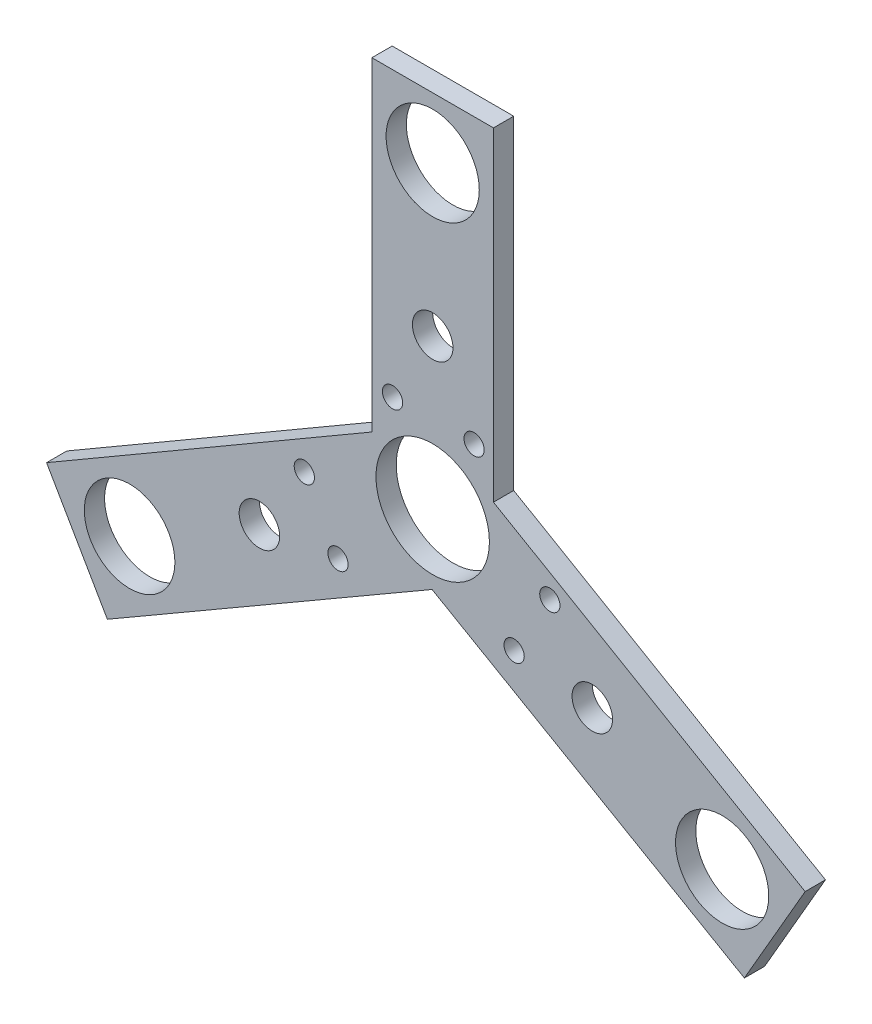
ISO-10303-21;
HEADER;
FILE_DESCRIPTION(('STEP AP214'),'2;1');
FILE_NAME('part.step','',(''),(''),'','','');
FILE_SCHEMA(('AUTOMOTIVE_DESIGN { 1 0 10303 214 1 1 1 1 }'));
ENDSEC;
DATA;
#1=APPLICATION_CONTEXT('core data for automotive mechanical design processes');
#2=APPLICATION_PROTOCOL_DEFINITION('international standard','automotive_design',2000,#1);
#3=PRODUCT_CONTEXT('',#1,'mechanical');
#4=PRODUCT('Part','Part','',(#3));
#5=PRODUCT_RELATED_PRODUCT_CATEGORY('part','',(#4));
#6=PRODUCT_DEFINITION_FORMATION('','',#4);
#7=PRODUCT_DEFINITION_CONTEXT('part definition',#1,'design');
#8=PRODUCT_DEFINITION('design','',#6,#7);
#9=PRODUCT_DEFINITION_SHAPE('','',#8);
#10=(LENGTH_UNIT() NAMED_UNIT(*) SI_UNIT(.MILLI.,.METRE.));
#11=(NAMED_UNIT(*) PLANE_ANGLE_UNIT() SI_UNIT($,.RADIAN.));
#12=(NAMED_UNIT(*) SI_UNIT($,.STERADIAN.) SOLID_ANGLE_UNIT());
#13=UNCERTAINTY_MEASURE_WITH_UNIT(LENGTH_MEASURE(1.E-05),#10,'distance_accuracy_value','');
#14=(GEOMETRIC_REPRESENTATION_CONTEXT(3) GLOBAL_UNCERTAINTY_ASSIGNED_CONTEXT((#13)) GLOBAL_UNIT_ASSIGNED_CONTEXT((#10,
#11,#12)) REPRESENTATION_CONTEXT('',''));
#15=CARTESIAN_POINT('',(0.,0.,0.));
#16=DIRECTION('',(0.,0.,1.));
#17=DIRECTION('',(1.,0.,0.));
#18=AXIS2_PLACEMENT_3D('',#15,#16,#17);
#19=CARTESIAN_POINT('',(-30.,178.,-10.));
#20=DIRECTION('',(-1.,0.,0.));
#21=DIRECTION('',(0.,-1.,0.));
#22=AXIS2_PLACEMENT_3D('',#19,#20,#21);
#23=PLANE('',#22);
#24=DIRECTION('',(0.,-1.,0.));
#25=VECTOR('',#24,1.);
#26=CARTESIAN_POINT('',(-30.,178.,0.));
#27=LINE('',#26,#25);
#28=CARTESIAN_POINT('',(-30.,178.,0.));
#29=VERTEX_POINT('',#28);
#30=CARTESIAN_POINT('',(-30.,18.,0.));
#31=VERTEX_POINT('',#30);
#32=EDGE_CURVE('E137',#29,#31,#27,.T.);
#33=ORIENTED_EDGE('',*,*,#32,.F.);
#34=DIRECTION('',(0.,0.,1.));
#35=VECTOR('',#34,1.);
#36=CARTESIAN_POINT('',(-30.,178.,-10.));
#37=LINE('',#36,#35);
#38=CARTESIAN_POINT('',(-30.,178.,-10.));
#39=VERTEX_POINT('',#38);
#40=EDGE_CURVE('E11',#39,#29,#37,.T.);
#41=ORIENTED_EDGE('',*,*,#40,.F.);
#42=DIRECTION('',(0.,-1.,0.));
#43=VECTOR('',#42,1.);
#44=CARTESIAN_POINT('',(-30.,178.,-10.));
#45=LINE('',#44,#43);
#46=CARTESIAN_POINT('',(-30.,18.,-10.));
#47=VERTEX_POINT('',#46);
#48=EDGE_CURVE('E161',#39,#47,#45,.T.);
#49=ORIENTED_EDGE('',*,*,#48,.T.);
#50=DIRECTION('',(0.,0.,1.));
#51=VECTOR('',#50,1.);
#52=CARTESIAN_POINT('',(-30.,18.,-10.));
#53=LINE('',#52,#51);
#54=EDGE_CURVE('E37',#47,#31,#53,.T.);
#55=ORIENTED_EDGE('',*,*,#54,.T.);
#56=EDGE_LOOP('',(#33,#41,#49,#55));
#57=FACE_BOUND('',#56,.T.);
#58=ADVANCED_FACE('F34',(#57),#23,.T.);
#59=CARTESIAN_POINT('',(-30.,178.,-10.));
#60=DIRECTION('',(0.,1.,0.));
#61=DIRECTION('',(0.,0.,1.));
#62=AXIS2_PLACEMENT_3D('',#59,#60,#61);
#63=PLANE('',#62);
#64=DIRECTION('',(-1.,0.,0.));
#65=VECTOR('',#64,1.);
#66=CARTESIAN_POINT('',(-30.,178.,0.));
#67=LINE('',#66,#65);
#68=CARTESIAN_POINT('',(30.,178.,0.));
#69=VERTEX_POINT('',#68);
#70=EDGE_CURVE('E159',#69,#29,#67,.T.);
#71=ORIENTED_EDGE('',*,*,#70,.F.);
#72=DIRECTION('',(0.,0.,1.));
#73=VECTOR('',#72,1.);
#74=CARTESIAN_POINT('',(30.,178.,-10.));
#75=LINE('',#74,#73);
#76=CARTESIAN_POINT('',(30.,178.,-10.));
#77=VERTEX_POINT('',#76);
#78=EDGE_CURVE('E43',#77,#69,#75,.T.);
#79=ORIENTED_EDGE('',*,*,#78,.F.);
#80=DIRECTION('',(-1.,0.,0.));
#81=VECTOR('',#80,1.);
#82=CARTESIAN_POINT('',(-30.,178.,-10.));
#83=LINE('',#82,#81);
#84=EDGE_CURVE('E127',#77,#39,#83,.T.);
#85=ORIENTED_EDGE('',*,*,#84,.T.);
#86=ORIENTED_EDGE('',*,*,#40,.T.);
#87=EDGE_LOOP('',(#71,#79,#85,#86));
#88=FACE_BOUND('',#87,.T.);
#89=ADVANCED_FACE('F175',(#88),#63,.T.);
#90=CARTESIAN_POINT('',(30.,178.,-10.));
#91=DIRECTION('',(1.,0.,0.));
#92=DIRECTION('',(0.,1.,0.));
#93=AXIS2_PLACEMENT_3D('',#90,#91,#92);
#94=PLANE('',#93);
#95=DIRECTION('',(0.,1.,0.));
#96=VECTOR('',#95,1.);
#97=CARTESIAN_POINT('',(30.,178.,0.));
#98=LINE('',#97,#96);
#99=CARTESIAN_POINT('',(30.,18.,0.));
#100=VERTEX_POINT('',#99);
#101=EDGE_CURVE('E114',#100,#69,#98,.T.);
#102=ORIENTED_EDGE('',*,*,#101,.F.);
#103=DIRECTION('',(0.,0.,1.));
#104=VECTOR('',#103,1.);
#105=CARTESIAN_POINT('',(30.,18.,-10.));
#106=LINE('',#105,#104);
#107=CARTESIAN_POINT('',(30.,18.,-10.));
#108=VERTEX_POINT('',#107);
#109=EDGE_CURVE('E109',#108,#100,#106,.T.);
#110=ORIENTED_EDGE('',*,*,#109,.F.);
#111=DIRECTION('',(0.,1.,0.));
#112=VECTOR('',#111,1.);
#113=CARTESIAN_POINT('',(30.,178.,-10.));
#114=LINE('',#113,#112);
#115=EDGE_CURVE('E112',#108,#77,#114,.T.);
#116=ORIENTED_EDGE('',*,*,#115,.T.);
#117=ORIENTED_EDGE('',*,*,#78,.T.);
#118=EDGE_LOOP('',(#102,#110,#116,#117));
#119=FACE_BOUND('',#118,.T.);
#120=ADVANCED_FACE('F111',(#119),#94,.T.);
#121=CARTESIAN_POINT('',(183.857450852518,-71.5091325908429,-10.));
#122=DIRECTION('',(0.502860295454174,0.864367701418639,0.));
#123=DIRECTION('',(-0.864367701418639,0.502860295454174,0.));
#124=AXIS2_PLACEMENT_3D('',#121,#122,#123);
#125=PLANE('',#124);
#126=DIRECTION('',(-0.864367701418639,0.502860295454174,0.));
#127=VECTOR('',#126,1.);
#128=CARTESIAN_POINT('',(183.857450852518,-71.5091325908429,0.));
#129=LINE('',#128,#127);
#130=CARTESIAN_POINT('',(183.857450852518,-71.5091325908429,0.));
#131=VERTEX_POINT('',#130);
#132=EDGE_CURVE('E156',#131,#100,#129,.T.);
#133=ORIENTED_EDGE('',*,*,#132,.F.);
#134=DIRECTION('',(0.,0.,1.));
#135=VECTOR('',#134,1.);
#136=CARTESIAN_POINT('',(183.857450852518,-71.5091325908429,-10.));
#137=LINE('',#136,#135);
#138=CARTESIAN_POINT('',(183.857450852518,-71.5091325908429,-10.));
#139=VERTEX_POINT('',#138);
#140=EDGE_CURVE('E119',#139,#131,#137,.T.);
#141=ORIENTED_EDGE('',*,*,#140,.F.);
#142=DIRECTION('',(-0.864367701418639,0.502860295454174,0.));
#143=VECTOR('',#142,1.);
#144=CARTESIAN_POINT('',(183.857450852518,-71.5091325908429,-10.));
#145=LINE('',#144,#143);
#146=EDGE_CURVE('E125',#139,#108,#145,.T.);
#147=ORIENTED_EDGE('',*,*,#146,.T.);
#148=ORIENTED_EDGE('',*,*,#109,.T.);
#149=EDGE_LOOP('',(#133,#141,#147,#148));
#150=FACE_BOUND('',#149,.T.);
#151=ADVANCED_FACE('F129',(#150),#125,.T.);
#152=CARTESIAN_POINT('',(183.857450852518,-71.5091325908429,-10.));
#153=DIRECTION('',(0.866025403784437,-0.500000000000004,0.));
#154=DIRECTION('',(0.500000000000004,0.866025403784437,0.));
#155=AXIS2_PLACEMENT_3D('',#152,#153,#154);
#156=PLANE('',#155);
#157=DIRECTION('',(0.500000000000004,0.866025403784437,0.));
#158=VECTOR('',#157,1.);
#159=CARTESIAN_POINT('',(183.857450852518,-71.5091325908429,0.));
#160=LINE('',#159,#158);
#161=CARTESIAN_POINT('',(153.857450852518,-123.470656817909,0.));
#162=VERTEX_POINT('',#161);
#163=EDGE_CURVE('E153',#162,#131,#160,.T.);
#164=ORIENTED_EDGE('',*,*,#163,.F.);
#165=DIRECTION('',(0.,0.,1.));
#166=VECTOR('',#165,1.);
#167=CARTESIAN_POINT('',(153.857450852518,-123.470656817909,-10.));
#168=LINE('',#167,#166);
#169=CARTESIAN_POINT('',(153.857450852518,-123.470656817909,-10.));
#170=VERTEX_POINT('',#169);
#171=EDGE_CURVE('E165',#170,#162,#168,.T.);
#172=ORIENTED_EDGE('',*,*,#171,.F.);
#173=DIRECTION('',(0.500000000000004,0.866025403784437,0.));
#174=VECTOR('',#173,1.);
#175=CARTESIAN_POINT('',(183.857450852518,-71.5091325908429,-10.));
#176=LINE('',#175,#174);
#177=EDGE_CURVE('E130',#170,#139,#176,.T.);
#178=ORIENTED_EDGE('',*,*,#177,.T.);
#179=ORIENTED_EDGE('',*,*,#140,.T.);
#180=EDGE_LOOP('',(#164,#172,#178,#179));
#181=FACE_BOUND('',#180,.T.);
#182=ADVANCED_FACE('F188',(#181),#156,.T.);
#183=CARTESIAN_POINT('',(153.857450852518,-123.470656817909,-10.));
#184=DIRECTION('',(-0.500000000000003,-0.866025403784437,0.));
#185=DIRECTION('',(0.866025403784437,-0.500000000000003,0.));
#186=AXIS2_PLACEMENT_3D('',#183,#184,#185);
#187=PLANE('',#186);
#188=DIRECTION('',(0.866025403784437,-0.500000000000003,0.));
#189=VECTOR('',#188,1.);
#190=CARTESIAN_POINT('',(153.857450852518,-123.470656817909,0.));
#191=LINE('',#190,#189);
#192=CARTESIAN_POINT('',(-0.295071021112231,-34.4706568179085,0.));
#193=VERTEX_POINT('',#192);
#194=EDGE_CURVE('E150',#193,#162,#191,.T.);
#195=ORIENTED_EDGE('',*,*,#194,.F.);
#196=DIRECTION('',(0.,0.,1.));
#197=VECTOR('',#196,1.);
#198=CARTESIAN_POINT('',(-0.295071021112231,-34.4706568179085,-10.));
#199=LINE('',#198,#197);
#200=CARTESIAN_POINT('',(-0.295071021112231,-34.4706568179085,-10.));
#201=VERTEX_POINT('',#200);
#202=EDGE_CURVE('E167',#201,#193,#199,.T.);
#203=ORIENTED_EDGE('',*,*,#202,.F.);
#204=DIRECTION('',(0.866025403784437,-0.500000000000003,0.));
#205=VECTOR('',#204,1.);
#206=CARTESIAN_POINT('',(153.857450852518,-123.470656817909,-10.));
#207=LINE('',#206,#205);
#208=EDGE_CURVE('E132',#201,#170,#207,.T.);
#209=ORIENTED_EDGE('',*,*,#208,.T.);
#210=ORIENTED_EDGE('',*,*,#171,.T.);
#211=EDGE_LOOP('',(#195,#203,#209,#210));
#212=FACE_BOUND('',#211,.T.);
#213=ADVANCED_FACE('F191',(#212),#187,.T.);
#214=CARTESIAN_POINT('',(-160.583702802877,-127.354060192087,-10.));
#215=DIRECTION('',(0.501378749161739,-0.865227917885808,0.));
#216=DIRECTION('',(0.865227917885808,0.501378749161739,0.));
#217=AXIS2_PLACEMENT_3D('',#214,#215,#216);
#218=PLANE('',#217);
#219=DIRECTION('',(0.865227917885808,0.501378749161739,0.));
#220=VECTOR('',#219,1.);
#221=CARTESIAN_POINT('',(-160.583702802877,-127.354060192087,0.));
#222=LINE('',#221,#220);
#223=CARTESIAN_POINT('',(-160.583702802877,-127.354060192087,0.));
#224=VERTEX_POINT('',#223);
#225=EDGE_CURVE('E147',#224,#193,#222,.T.);
#226=ORIENTED_EDGE('',*,*,#225,.F.);
#227=DIRECTION('',(0.,0.,1.));
#228=VECTOR('',#227,1.);
#229=CARTESIAN_POINT('',(-160.583702802877,-127.354060192087,-10.));
#230=LINE('',#229,#228);
#231=CARTESIAN_POINT('',(-160.583702802877,-127.354060192087,-10.));
#232=VERTEX_POINT('',#231);
#233=EDGE_CURVE('E169',#232,#224,#230,.T.);
#234=ORIENTED_EDGE('',*,*,#233,.F.);
#235=DIRECTION('',(0.865227917885808,0.501378749161739,0.));
#236=VECTOR('',#235,1.);
#237=CARTESIAN_POINT('',(-160.583702802877,-127.354060192087,-10.));
#238=LINE('',#237,#236);
#239=EDGE_CURVE('E354',#232,#201,#238,.T.);
#240=ORIENTED_EDGE('',*,*,#239,.T.);
#241=ORIENTED_EDGE('',*,*,#202,.T.);
#242=EDGE_LOOP('',(#226,#234,#240,#241));
#243=FACE_BOUND('',#242,.T.);
#244=ADVANCED_FACE('F195',(#243),#218,.T.);
#245=CARTESIAN_POINT('',(-190.583702802877,-75.3925359650204,-10.));
#246=DIRECTION('',(-0.866025403784436,-0.500000000000005,0.));
#247=DIRECTION('',(0.500000000000005,-0.866025403784436,0.));
#248=AXIS2_PLACEMENT_3D('',#245,#246,#247);
#249=PLANE('',#248);
#250=DIRECTION('',(0.500000000000005,-0.866025403784436,0.));
#251=VECTOR('',#250,1.);
#252=CARTESIAN_POINT('',(-190.583702802877,-75.3925359650204,0.));
#253=LINE('',#252,#251);
#254=CARTESIAN_POINT('',(-190.583702802877,-75.3925359650204,0.));
#255=VERTEX_POINT('',#254);
#256=EDGE_CURVE('E144',#255,#224,#253,.T.);
#257=ORIENTED_EDGE('',*,*,#256,.F.);
#258=DIRECTION('',(0.,0.,1.));
#259=VECTOR('',#258,1.);
#260=CARTESIAN_POINT('',(-190.583702802877,-75.3925359650204,-10.));
#261=LINE('',#260,#259);
#262=CARTESIAN_POINT('',(-190.583702802877,-75.3925359650204,-10.));
#263=VERTEX_POINT('',#262);
#264=EDGE_CURVE('E170',#263,#255,#261,.T.);
#265=ORIENTED_EDGE('',*,*,#264,.F.);
#266=DIRECTION('',(0.500000000000005,-0.866025403784436,0.));
#267=VECTOR('',#266,1.);
#268=CARTESIAN_POINT('',(-190.583702802877,-75.3925359650204,-10.));
#269=LINE('',#268,#267);
#270=EDGE_CURVE('E351',#263,#232,#269,.T.);
#271=ORIENTED_EDGE('',*,*,#270,.T.);
#272=ORIENTED_EDGE('',*,*,#233,.T.);
#273=EDGE_LOOP('',(#257,#265,#271,#272));
#274=FACE_BOUND('',#273,.T.);
#275=ADVANCED_FACE('F199',(#274),#249,.T.);
#276=CARTESIAN_POINT('',(-190.583702802877,-75.3925359650204,-10.));
#277=DIRECTION('',(-0.502740818154461,0.864437198274914,0.));
#278=DIRECTION('',(-0.864437198274914,-0.502740818154461,0.));
#279=AXIS2_PLACEMENT_3D('',#276,#277,#278);
#280=PLANE('',#279);
#281=DIRECTION('',(-0.864437198274914,-0.502740818154461,0.));
#282=VECTOR('',#281,1.);
#283=CARTESIAN_POINT('',(-190.583702802877,-75.3925359650204,0.));
#284=LINE('',#283,#282);
#285=EDGE_CURVE('E140',#31,#255,#284,.T.);
#286=ORIENTED_EDGE('',*,*,#285,.F.);
#287=ORIENTED_EDGE('',*,*,#54,.F.);
#288=DIRECTION('',(-0.864437198274914,-0.502740818154461,0.));
#289=VECTOR('',#288,1.);
#290=CARTESIAN_POINT('',(-190.583702802877,-75.3925359650204,-10.));
#291=LINE('',#290,#289);
#292=EDGE_CURVE('E349',#47,#263,#291,.T.);
#293=ORIENTED_EDGE('',*,*,#292,.T.);
#294=ORIENTED_EDGE('',*,*,#264,.T.);
#295=EDGE_LOOP('',(#286,#287,#293,#294));
#296=FACE_BOUND('',#295,.T.);
#297=ADVANCED_FACE('F172',(#296),#280,.T.);
#298=CARTESIAN_POINT('',(0.,0.,-10.));
#299=DIRECTION('',(0.,0.,1.));
#300=DIRECTION('',(1.,0.,0.));
#301=AXIS2_PLACEMENT_3D('',#298,#299,#300);
#302=PLANE('',#301);
#303=CARTESIAN_POINT('',(20.4343381594574,38.,-10.));
#304=DIRECTION('',(0.,0.,1.));
#305=DIRECTION('',(1.,0.,0.));
#306=AXIS2_PLACEMENT_3D('',#303,#304,#305);
#307=CIRCLE('',#306,5.);
#308=CARTESIAN_POINT('',(25.4343381594574,38.,-10.));
#309=VERTEX_POINT('',#308);
#310=EDGE_CURVE('E270',#309,#309,#307,.T.);
#311=ORIENTED_EDGE('',*,*,#310,.T.);
#312=EDGE_LOOP('',(#311));
#313=FACE_BOUND('',#312,.T.);
#314=CARTESIAN_POINT('',(-19.8060492100925,38.,-10.));
#315=DIRECTION('',(0.,0.,1.));
#316=DIRECTION('',(1.,0.,0.));
#317=AXIS2_PLACEMENT_3D('',#314,#315,#316);
#318=CIRCLE('',#317,5.);
#319=CARTESIAN_POINT('',(-14.8060492100925,38.,-10.));
#320=VERTEX_POINT('',#319);
#321=EDGE_CURVE('E278',#320,#320,#318,.T.);
#322=ORIENTED_EDGE('',*,*,#321,.T.);
#323=EDGE_LOOP('',(#322));
#324=FACE_BOUND('',#323,.T.);
#325=CARTESIAN_POINT('',(57.8360272755283,-9.78464106834701,-10.));
#326=DIRECTION('',(0.,0.,1.));
#327=DIRECTION('',(1.,0.,0.));
#328=AXIS2_PLACEMENT_3D('',#325,#326,#327);
#329=CIRCLE('',#328,5.);
#330=CARTESIAN_POINT('',(62.8360272755283,-9.78464106834701,-10.));
#331=VERTEX_POINT('',#330);
#332=EDGE_CURVE('E284',#331,#331,#329,.T.);
#333=ORIENTED_EDGE('',*,*,#332,.T.);
#334=EDGE_LOOP('',(#333));
#335=FACE_BOUND('',#334,.T.);
#336=CARTESIAN_POINT('',(40.2010636968261,-40.3292939762859,-10.));
#337=DIRECTION('',(0.,0.,1.));
#338=DIRECTION('',(1.,0.,0.));
#339=AXIS2_PLACEMENT_3D('',#336,#337,#338);
#340=CIRCLE('',#339,5.);
#341=CARTESIAN_POINT('',(45.2010636968261,-40.3292939762859,-10.));
#342=VERTEX_POINT('',#341);
#343=EDGE_CURVE('E290',#342,#342,#340,.T.);
#344=ORIENTED_EDGE('',*,*,#343,.T.);
#345=EDGE_LOOP('',(#344));
#346=FACE_BOUND('',#345,.T.);
#347=CARTESIAN_POINT('',(-63.3541501399859,-15.760585401408,-10.));
#348=DIRECTION('',(0.,0.,1.));
#349=DIRECTION('',(1.,0.,0.));
#350=AXIS2_PLACEMENT_3D('',#347,#348,#349);
#351=CIRCLE('',#350,5.);
#352=CARTESIAN_POINT('',(-58.3541501399859,-15.760585401408,-10.));
#353=VERTEX_POINT('',#352);
#354=EDGE_CURVE('E296',#353,#353,#351,.T.);
#355=ORIENTED_EDGE('',*,*,#354,.T.);
#356=EDGE_LOOP('',(#355));
#357=FACE_BOUND('',#356,.T.);
#358=CARTESIAN_POINT('',(-46.7390778813396,-44.5387347248116,-10.));
#359=DIRECTION('',(0.,0.,1.));
#360=DIRECTION('',(1.,0.,0.));
#361=AXIS2_PLACEMENT_3D('',#358,#359,#360);
#362=CIRCLE('',#361,5.);
#363=CARTESIAN_POINT('',(-41.7390778813396,-44.5387347248116,-10.));
#364=VERTEX_POINT('',#363);
#365=EDGE_CURVE('E302',#364,#364,#362,.T.);
#366=ORIENTED_EDGE('',*,*,#365,.T.);
#367=EDGE_LOOP('',(#366));
#368=FACE_BOUND('',#367,.T.);
#369=CARTESIAN_POINT('',(78.7908088589362,-45.4898947043756,-10.));
#370=DIRECTION('',(0.,0.,1.));
#371=DIRECTION('',(1.,0.,0.));
#372=AXIS2_PLACEMENT_3D('',#369,#370,#371);
#373=CIRCLE('',#372,9.99999999999999);
#374=CARTESIAN_POINT('',(88.7908088589362,-45.4898947043756,-10.));
#375=VERTEX_POINT('',#374);
#376=EDGE_CURVE('E308',#375,#375,#373,.T.);
#377=ORIENTED_EDGE('',*,*,#376,.T.);
#378=EDGE_LOOP('',(#377));
#379=FACE_BOUND('',#378,.T.);
#380=CARTESIAN_POINT('',(-85.5170608092956,-49.373298078553,-10.));
#381=DIRECTION('',(0.,0.,1.));
#382=DIRECTION('',(1.,0.,0.));
#383=AXIS2_PLACEMENT_3D('',#380,#381,#382);
#384=CIRCLE('',#383,10.);
#385=CARTESIAN_POINT('',(-75.5170608092956,-49.373298078553,-10.));
#386=VERTEX_POINT('',#385);
#387=EDGE_CURVE('E314',#386,#386,#384,.T.);
#388=ORIENTED_EDGE('',*,*,#387,.T.);
#389=EDGE_LOOP('',(#388));
#390=FACE_BOUND('',#389,.T.);
#391=CARTESIAN_POINT('',(0.,74.,-10.));
#392=DIRECTION('',(0.,0.,1.));
#393=DIRECTION('',(1.,0.,0.));
#394=AXIS2_PLACEMENT_3D('',#391,#392,#393);
#395=CIRCLE('',#394,10.);
#396=CARTESIAN_POINT('',(9.99999999999998,74.,-10.));
#397=VERTEX_POINT('',#396);
#398=EDGE_CURVE('E320',#397,#397,#395,.T.);
#399=ORIENTED_EDGE('',*,*,#398,.T.);
#400=EDGE_LOOP('',(#399));
#401=FACE_BOUND('',#400,.T.);
#402=CARTESIAN_POINT('',(142.876688738985,-82.4898947043759,-10.));
#403=DIRECTION('',(0.,0.,1.));
#404=DIRECTION('',(1.,0.,0.));
#405=AXIS2_PLACEMENT_3D('',#402,#403,#404);
#406=CIRCLE('',#405,23.);
#407=CARTESIAN_POINT('',(165.876688738985,-82.4898947043759,-10.));
#408=VERTEX_POINT('',#407);
#409=EDGE_CURVE('E326',#408,#408,#406,.T.);
#410=ORIENTED_EDGE('',*,*,#409,.T.);
#411=EDGE_LOOP('',(#410));
#412=FACE_BOUND('',#411,.T.);
#413=CARTESIAN_POINT('',(-149.602940689344,-86.3732980785533,-10.));
#414=DIRECTION('',(0.,0.,1.));
#415=DIRECTION('',(1.,0.,0.));
#416=AXIS2_PLACEMENT_3D('',#413,#414,#415);
#417=CIRCLE('',#416,22.3568896627091);
#418=CARTESIAN_POINT('',(-127.246051026635,-86.3732980785533,-10.));
#419=VERTEX_POINT('',#418);
#420=EDGE_CURVE('E332',#419,#419,#417,.T.);
#421=ORIENTED_EDGE('',*,*,#420,.T.);
#422=EDGE_LOOP('',(#421));
#423=FACE_BOUND('',#422,.T.);
#424=CARTESIAN_POINT('',(0.,148.,-10.));
#425=DIRECTION('',(0.,0.,1.));
#426=DIRECTION('',(1.,0.,0.));
#427=AXIS2_PLACEMENT_3D('',#424,#425,#426);
#428=CIRCLE('',#427,23.);
#429=CARTESIAN_POINT('',(23.,148.,-10.));
#430=VERTEX_POINT('',#429);
#431=EDGE_CURVE('E338',#430,#430,#428,.T.);
#432=ORIENTED_EDGE('',*,*,#431,.T.);
#433=EDGE_LOOP('',(#432));
#434=FACE_BOUND('',#433,.T.);
#435=CARTESIAN_POINT('',(0.,0.,-10.));
#436=DIRECTION('',(0.,0.,1.));
#437=DIRECTION('',(1.,0.,0.));
#438=AXIS2_PLACEMENT_3D('',#435,#436,#437);
#439=CIRCLE('',#438,28.);
#440=CARTESIAN_POINT('',(28.,0.,-10.));
#441=VERTEX_POINT('',#440);
#442=EDGE_CURVE('E141',#441,#441,#439,.T.);
#443=ORIENTED_EDGE('',*,*,#442,.T.);
#444=EDGE_LOOP('',(#443));
#445=FACE_BOUND('',#444,.T.);
#446=ORIENTED_EDGE('',*,*,#48,.F.);
#447=ORIENTED_EDGE('',*,*,#84,.F.);
#448=ORIENTED_EDGE('',*,*,#115,.F.);
#449=ORIENTED_EDGE('',*,*,#146,.F.);
#450=ORIENTED_EDGE('',*,*,#177,.F.);
#451=ORIENTED_EDGE('',*,*,#208,.F.);
#452=ORIENTED_EDGE('',*,*,#239,.F.);
#453=ORIENTED_EDGE('',*,*,#270,.F.);
#454=ORIENTED_EDGE('',*,*,#292,.F.);
#455=EDGE_LOOP('',(#446,#447,#448,#449,#450,#451,#452,#453,#454));
#456=FACE_BOUND('',#455,.T.);
#457=ADVANCED_FACE('F123',(#313,#324,#335,#346,#357,#368,#379,#390,#401,#412,#423,#434,#445,
#456),#302,.F.);
#458=CARTESIAN_POINT('',(0.,0.,0.));
#459=DIRECTION('',(0.,0.,1.));
#460=DIRECTION('',(1.,0.,0.));
#461=AXIS2_PLACEMENT_3D('',#458,#459,#460);
#462=PLANE('',#461);
#463=CARTESIAN_POINT('',(20.4343381594574,38.,0.));
#464=DIRECTION('',(0.,0.,1.));
#465=DIRECTION('',(1.,0.,0.));
#466=AXIS2_PLACEMENT_3D('',#463,#464,#465);
#467=CIRCLE('',#466,5.);
#468=CARTESIAN_POINT('',(25.4343381594574,38.,0.));
#469=VERTEX_POINT('',#468);
#470=EDGE_CURVE('E273',#469,#469,#467,.T.);
#471=ORIENTED_EDGE('',*,*,#470,.F.);
#472=EDGE_LOOP('',(#471));
#473=FACE_BOUND('',#472,.T.);
#474=CARTESIAN_POINT('',(-19.8060492100925,38.,0.));
#475=DIRECTION('',(0.,0.,1.));
#476=DIRECTION('',(1.,0.,0.));
#477=AXIS2_PLACEMENT_3D('',#474,#475,#476);
#478=CIRCLE('',#477,5.);
#479=CARTESIAN_POINT('',(-14.8060492100925,38.,0.));
#480=VERTEX_POINT('',#479);
#481=EDGE_CURVE('E275',#480,#480,#478,.T.);
#482=ORIENTED_EDGE('',*,*,#481,.F.);
#483=EDGE_LOOP('',(#482));
#484=FACE_BOUND('',#483,.T.);
#485=CARTESIAN_POINT('',(57.8360272755283,-9.78464106834701,0.));
#486=DIRECTION('',(0.,0.,1.));
#487=DIRECTION('',(1.,0.,0.));
#488=AXIS2_PLACEMENT_3D('',#485,#486,#487);
#489=CIRCLE('',#488,5.);
#490=CARTESIAN_POINT('',(62.8360272755283,-9.78464106834701,0.));
#491=VERTEX_POINT('',#490);
#492=EDGE_CURVE('E281',#491,#491,#489,.T.);
#493=ORIENTED_EDGE('',*,*,#492,.F.);
#494=EDGE_LOOP('',(#493));
#495=FACE_BOUND('',#494,.T.);
#496=CARTESIAN_POINT('',(40.2010636968261,-40.3292939762859,0.));
#497=DIRECTION('',(0.,0.,1.));
#498=DIRECTION('',(1.,0.,0.));
#499=AXIS2_PLACEMENT_3D('',#496,#497,#498);
#500=CIRCLE('',#499,5.);
#501=CARTESIAN_POINT('',(45.2010636968261,-40.3292939762859,0.));
#502=VERTEX_POINT('',#501);
#503=EDGE_CURVE('E287',#502,#502,#500,.T.);
#504=ORIENTED_EDGE('',*,*,#503,.F.);
#505=EDGE_LOOP('',(#504));
#506=FACE_BOUND('',#505,.T.);
#507=CARTESIAN_POINT('',(-63.3541501399859,-15.760585401408,0.));
#508=DIRECTION('',(0.,0.,1.));
#509=DIRECTION('',(1.,0.,0.));
#510=AXIS2_PLACEMENT_3D('',#507,#508,#509);
#511=CIRCLE('',#510,5.);
#512=CARTESIAN_POINT('',(-58.3541501399859,-15.760585401408,0.));
#513=VERTEX_POINT('',#512);
#514=EDGE_CURVE('E293',#513,#513,#511,.T.);
#515=ORIENTED_EDGE('',*,*,#514,.F.);
#516=EDGE_LOOP('',(#515));
#517=FACE_BOUND('',#516,.T.);
#518=CARTESIAN_POINT('',(-46.7390778813396,-44.5387347248116,0.));
#519=DIRECTION('',(0.,0.,1.));
#520=DIRECTION('',(1.,0.,0.));
#521=AXIS2_PLACEMENT_3D('',#518,#519,#520);
#522=CIRCLE('',#521,5.);
#523=CARTESIAN_POINT('',(-41.7390778813396,-44.5387347248116,0.));
#524=VERTEX_POINT('',#523);
#525=EDGE_CURVE('E299',#524,#524,#522,.T.);
#526=ORIENTED_EDGE('',*,*,#525,.F.);
#527=EDGE_LOOP('',(#526));
#528=FACE_BOUND('',#527,.T.);
#529=CARTESIAN_POINT('',(78.7908088589362,-45.4898947043756,0.));
#530=DIRECTION('',(0.,0.,1.));
#531=DIRECTION('',(1.,0.,0.));
#532=AXIS2_PLACEMENT_3D('',#529,#530,#531);
#533=CIRCLE('',#532,9.99999999999999);
#534=CARTESIAN_POINT('',(88.7908088589362,-45.4898947043756,0.));
#535=VERTEX_POINT('',#534);
#536=EDGE_CURVE('E305',#535,#535,#533,.T.);
#537=ORIENTED_EDGE('',*,*,#536,.F.);
#538=EDGE_LOOP('',(#537));
#539=FACE_BOUND('',#538,.T.);
#540=CARTESIAN_POINT('',(-85.5170608092956,-49.373298078553,0.));
#541=DIRECTION('',(0.,0.,1.));
#542=DIRECTION('',(1.,0.,0.));
#543=AXIS2_PLACEMENT_3D('',#540,#541,#542);
#544=CIRCLE('',#543,10.);
#545=CARTESIAN_POINT('',(-75.5170608092956,-49.373298078553,0.));
#546=VERTEX_POINT('',#545);
#547=EDGE_CURVE('E311',#546,#546,#544,.T.);
#548=ORIENTED_EDGE('',*,*,#547,.F.);
#549=EDGE_LOOP('',(#548));
#550=FACE_BOUND('',#549,.T.);
#551=CARTESIAN_POINT('',(0.,74.,0.));
#552=DIRECTION('',(0.,0.,1.));
#553=DIRECTION('',(1.,0.,0.));
#554=AXIS2_PLACEMENT_3D('',#551,#552,#553);
#555=CIRCLE('',#554,10.);
#556=CARTESIAN_POINT('',(9.99999999999998,74.,0.));
#557=VERTEX_POINT('',#556);
#558=EDGE_CURVE('E317',#557,#557,#555,.T.);
#559=ORIENTED_EDGE('',*,*,#558,.F.);
#560=EDGE_LOOP('',(#559));
#561=FACE_BOUND('',#560,.T.);
#562=CARTESIAN_POINT('',(142.876688738985,-82.4898947043759,0.));
#563=DIRECTION('',(0.,0.,1.));
#564=DIRECTION('',(1.,0.,0.));
#565=AXIS2_PLACEMENT_3D('',#562,#563,#564);
#566=CIRCLE('',#565,23.);
#567=CARTESIAN_POINT('',(165.876688738985,-82.4898947043759,0.));
#568=VERTEX_POINT('',#567);
#569=EDGE_CURVE('E323',#568,#568,#566,.T.);
#570=ORIENTED_EDGE('',*,*,#569,.F.);
#571=EDGE_LOOP('',(#570));
#572=FACE_BOUND('',#571,.T.);
#573=CARTESIAN_POINT('',(-149.602940689344,-86.3732980785533,0.));
#574=DIRECTION('',(0.,0.,1.));
#575=DIRECTION('',(1.,0.,0.));
#576=AXIS2_PLACEMENT_3D('',#573,#574,#575);
#577=CIRCLE('',#576,22.3568896627091);
#578=CARTESIAN_POINT('',(-127.246051026635,-86.3732980785533,0.));
#579=VERTEX_POINT('',#578);
#580=EDGE_CURVE('E329',#579,#579,#577,.T.);
#581=ORIENTED_EDGE('',*,*,#580,.F.);
#582=EDGE_LOOP('',(#581));
#583=FACE_BOUND('',#582,.T.);
#584=CARTESIAN_POINT('',(0.,148.,0.));
#585=DIRECTION('',(0.,0.,1.));
#586=DIRECTION('',(1.,0.,0.));
#587=AXIS2_PLACEMENT_3D('',#584,#585,#586);
#588=CIRCLE('',#587,23.);
#589=CARTESIAN_POINT('',(23.,148.,0.));
#590=VERTEX_POINT('',#589);
#591=EDGE_CURVE('E335',#590,#590,#588,.T.);
#592=ORIENTED_EDGE('',*,*,#591,.F.);
#593=EDGE_LOOP('',(#592));
#594=FACE_BOUND('',#593,.T.);
#595=CARTESIAN_POINT('',(0.,0.,0.));
#596=DIRECTION('',(0.,0.,1.));
#597=DIRECTION('',(1.,0.,0.));
#598=AXIS2_PLACEMENT_3D('',#595,#596,#597);
#599=CIRCLE('',#598,28.);
#600=CARTESIAN_POINT('',(28.,0.,0.));
#601=VERTEX_POINT('',#600);
#602=EDGE_CURVE('E341',#601,#601,#599,.T.);
#603=ORIENTED_EDGE('',*,*,#602,.F.);
#604=EDGE_LOOP('',(#603));
#605=FACE_BOUND('',#604,.T.);
#606=ORIENTED_EDGE('',*,*,#32,.T.);
#607=ORIENTED_EDGE('',*,*,#285,.T.);
#608=ORIENTED_EDGE('',*,*,#256,.T.);
#609=ORIENTED_EDGE('',*,*,#225,.T.);
#610=ORIENTED_EDGE('',*,*,#194,.T.);
#611=ORIENTED_EDGE('',*,*,#163,.T.);
#612=ORIENTED_EDGE('',*,*,#132,.T.);
#613=ORIENTED_EDGE('',*,*,#101,.T.);
#614=ORIENTED_EDGE('',*,*,#70,.T.);
#615=EDGE_LOOP('',(#606,#607,#608,#609,#610,#611,#612,#613,#614));
#616=FACE_BOUND('',#615,.T.);
#617=ADVANCED_FACE('F174',(#473,#484,#495,#506,#517,#528,#539,#550,#561,#572,#583,#594,#605,
#616),#462,.T.);
#618=CARTESIAN_POINT('',(0.,0.,-10.));
#619=DIRECTION('',(0.,0.,1.));
#620=DIRECTION('',(1.,0.,0.));
#621=AXIS2_PLACEMENT_3D('',#618,#619,#620);
#622=CYLINDRICAL_SURFACE('',#621,28.);
#623=ORIENTED_EDGE('',*,*,#442,.F.);
#624=EDGE_LOOP('',(#623));
#625=FACE_BOUND('',#624,.T.);
#626=ORIENTED_EDGE('',*,*,#602,.T.);
#627=EDGE_LOOP('',(#626));
#628=FACE_BOUND('',#627,.T.);
#629=ADVANCED_FACE('F211',(#625,#628),#622,.F.);
#630=CARTESIAN_POINT('',(0.,148.,-10.));
#631=DIRECTION('',(0.,0.,1.));
#632=DIRECTION('',(1.,0.,0.));
#633=AXIS2_PLACEMENT_3D('',#630,#631,#632);
#634=CYLINDRICAL_SURFACE('',#633,23.);
#635=ORIENTED_EDGE('',*,*,#431,.F.);
#636=EDGE_LOOP('',(#635));
#637=FACE_BOUND('',#636,.T.);
#638=ORIENTED_EDGE('',*,*,#591,.T.);
#639=EDGE_LOOP('',(#638));
#640=FACE_BOUND('',#639,.T.);
#641=ADVANCED_FACE('F218',(#637,#640),#634,.F.);
#642=CARTESIAN_POINT('',(-149.602940689344,-86.3732980785533,-10.));
#643=DIRECTION('',(0.,0.,1.));
#644=DIRECTION('',(1.,0.,0.));
#645=AXIS2_PLACEMENT_3D('',#642,#643,#644);
#646=CYLINDRICAL_SURFACE('',#645,22.3568896627091);
#647=ORIENTED_EDGE('',*,*,#420,.F.);
#648=EDGE_LOOP('',(#647));
#649=FACE_BOUND('',#648,.T.);
#650=ORIENTED_EDGE('',*,*,#580,.T.);
#651=EDGE_LOOP('',(#650));
#652=FACE_BOUND('',#651,.T.);
#653=ADVANCED_FACE('F222',(#649,#652),#646,.F.);
#654=CARTESIAN_POINT('',(142.876688738985,-82.4898947043759,-10.));
#655=DIRECTION('',(0.,0.,1.));
#656=DIRECTION('',(1.,0.,0.));
#657=AXIS2_PLACEMENT_3D('',#654,#655,#656);
#658=CYLINDRICAL_SURFACE('',#657,23.);
#659=ORIENTED_EDGE('',*,*,#409,.F.);
#660=EDGE_LOOP('',(#659));
#661=FACE_BOUND('',#660,.T.);
#662=ORIENTED_EDGE('',*,*,#569,.T.);
#663=EDGE_LOOP('',(#662));
#664=FACE_BOUND('',#663,.T.);
#665=ADVANCED_FACE('F226',(#661,#664),#658,.F.);
#666=CARTESIAN_POINT('',(0.,74.,-10.));
#667=DIRECTION('',(0.,0.,1.));
#668=DIRECTION('',(1.,0.,0.));
#669=AXIS2_PLACEMENT_3D('',#666,#667,#668);
#670=CYLINDRICAL_SURFACE('',#669,10.);
#671=ORIENTED_EDGE('',*,*,#398,.F.);
#672=EDGE_LOOP('',(#671));
#673=FACE_BOUND('',#672,.T.);
#674=ORIENTED_EDGE('',*,*,#558,.T.);
#675=EDGE_LOOP('',(#674));
#676=FACE_BOUND('',#675,.T.);
#677=ADVANCED_FACE('F230',(#673,#676),#670,.F.);
#678=CARTESIAN_POINT('',(-85.5170608092956,-49.373298078553,-10.));
#679=DIRECTION('',(0.,0.,1.));
#680=DIRECTION('',(1.,0.,0.));
#681=AXIS2_PLACEMENT_3D('',#678,#679,#680);
#682=CYLINDRICAL_SURFACE('',#681,10.);
#683=ORIENTED_EDGE('',*,*,#387,.F.);
#684=EDGE_LOOP('',(#683));
#685=FACE_BOUND('',#684,.T.);
#686=ORIENTED_EDGE('',*,*,#547,.T.);
#687=EDGE_LOOP('',(#686));
#688=FACE_BOUND('',#687,.T.);
#689=ADVANCED_FACE('F234',(#685,#688),#682,.F.);
#690=CARTESIAN_POINT('',(78.7908088589362,-45.4898947043756,-10.));
#691=DIRECTION('',(0.,0.,1.));
#692=DIRECTION('',(1.,0.,0.));
#693=AXIS2_PLACEMENT_3D('',#690,#691,#692);
#694=CYLINDRICAL_SURFACE('',#693,9.99999999999999);
#695=ORIENTED_EDGE('',*,*,#376,.F.);
#696=EDGE_LOOP('',(#695));
#697=FACE_BOUND('',#696,.T.);
#698=ORIENTED_EDGE('',*,*,#536,.T.);
#699=EDGE_LOOP('',(#698));
#700=FACE_BOUND('',#699,.T.);
#701=ADVANCED_FACE('F238',(#697,#700),#694,.F.);
#702=CARTESIAN_POINT('',(-46.7390778813396,-44.5387347248116,-10.));
#703=DIRECTION('',(0.,0.,1.));
#704=DIRECTION('',(1.,0.,0.));
#705=AXIS2_PLACEMENT_3D('',#702,#703,#704);
#706=CYLINDRICAL_SURFACE('',#705,5.);
#707=ORIENTED_EDGE('',*,*,#365,.F.);
#708=EDGE_LOOP('',(#707));
#709=FACE_BOUND('',#708,.T.);
#710=ORIENTED_EDGE('',*,*,#525,.T.);
#711=EDGE_LOOP('',(#710));
#712=FACE_BOUND('',#711,.T.);
#713=ADVANCED_FACE('F242',(#709,#712),#706,.F.);
#714=CARTESIAN_POINT('',(-63.3541501399859,-15.760585401408,-10.));
#715=DIRECTION('',(0.,0.,1.));
#716=DIRECTION('',(1.,0.,0.));
#717=AXIS2_PLACEMENT_3D('',#714,#715,#716);
#718=CYLINDRICAL_SURFACE('',#717,5.);
#719=ORIENTED_EDGE('',*,*,#354,.F.);
#720=EDGE_LOOP('',(#719));
#721=FACE_BOUND('',#720,.T.);
#722=ORIENTED_EDGE('',*,*,#514,.T.);
#723=EDGE_LOOP('',(#722));
#724=FACE_BOUND('',#723,.T.);
#725=ADVANCED_FACE('F246',(#721,#724),#718,.F.);
#726=CARTESIAN_POINT('',(40.2010636968261,-40.3292939762859,-10.));
#727=DIRECTION('',(0.,0.,1.));
#728=DIRECTION('',(1.,0.,0.));
#729=AXIS2_PLACEMENT_3D('',#726,#727,#728);
#730=CYLINDRICAL_SURFACE('',#729,5.);
#731=ORIENTED_EDGE('',*,*,#343,.F.);
#732=EDGE_LOOP('',(#731));
#733=FACE_BOUND('',#732,.T.);
#734=ORIENTED_EDGE('',*,*,#503,.T.);
#735=EDGE_LOOP('',(#734));
#736=FACE_BOUND('',#735,.T.);
#737=ADVANCED_FACE('F250',(#733,#736),#730,.F.);
#738=CARTESIAN_POINT('',(57.8360272755283,-9.78464106834701,-10.));
#739=DIRECTION('',(0.,0.,1.));
#740=DIRECTION('',(1.,0.,0.));
#741=AXIS2_PLACEMENT_3D('',#738,#739,#740);
#742=CYLINDRICAL_SURFACE('',#741,5.);
#743=ORIENTED_EDGE('',*,*,#332,.F.);
#744=EDGE_LOOP('',(#743));
#745=FACE_BOUND('',#744,.T.);
#746=ORIENTED_EDGE('',*,*,#492,.T.);
#747=EDGE_LOOP('',(#746));
#748=FACE_BOUND('',#747,.T.);
#749=ADVANCED_FACE('F254',(#745,#748),#742,.F.);
#750=CARTESIAN_POINT('',(-19.8060492100925,38.,-10.));
#751=DIRECTION('',(0.,0.,1.));
#752=DIRECTION('',(1.,0.,0.));
#753=AXIS2_PLACEMENT_3D('',#750,#751,#752);
#754=CYLINDRICAL_SURFACE('',#753,5.);
#755=ORIENTED_EDGE('',*,*,#321,.F.);
#756=EDGE_LOOP('',(#755));
#757=FACE_BOUND('',#756,.T.);
#758=ORIENTED_EDGE('',*,*,#481,.T.);
#759=EDGE_LOOP('',(#758));
#760=FACE_BOUND('',#759,.T.);
#761=ADVANCED_FACE('F258',(#757,#760),#754,.F.);
#762=CARTESIAN_POINT('',(20.4343381594574,38.,-10.));
#763=DIRECTION('',(0.,0.,1.));
#764=DIRECTION('',(1.,0.,0.));
#765=AXIS2_PLACEMENT_3D('',#762,#763,#764);
#766=CYLINDRICAL_SURFACE('',#765,5.);
#767=ORIENTED_EDGE('',*,*,#310,.F.);
#768=EDGE_LOOP('',(#767));
#769=FACE_BOUND('',#768,.T.);
#770=ORIENTED_EDGE('',*,*,#470,.T.);
#771=EDGE_LOOP('',(#770));
#772=FACE_BOUND('',#771,.T.);
#773=ADVANCED_FACE('F262',(#769,#772),#766,.F.);
#774=CLOSED_SHELL('',(#58,#89,#120,#151,#182,#213,#244,#275,#297,#457,#617,#629,#641,#653,#665,
#677,#689,#701,#713,#725,#737,#749,#761,#773));
#775=MANIFOLD_SOLID_BREP('B2',#774);
#776=ADVANCED_BREP_SHAPE_REPRESENTATION('',(#18,#775),#14);
#777=SHAPE_DEFINITION_REPRESENTATION(#9,#776);
ENDSEC;
END-ISO-10303-21;
